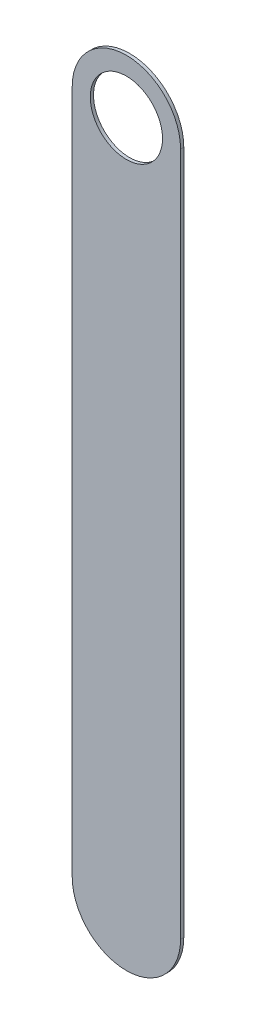
ISO-10303-21;
HEADER;
FILE_DESCRIPTION(('STEP AP214'),'2;1');
FILE_NAME('part.step','',(''),(''),'','','');
FILE_SCHEMA(('AUTOMOTIVE_DESIGN { 1 0 10303 214 1 1 1 1 }'));
ENDSEC;
DATA;
#1=APPLICATION_CONTEXT('core data for automotive mechanical design processes');
#2=APPLICATION_PROTOCOL_DEFINITION('international standard','automotive_design',2000,#1);
#3=PRODUCT_CONTEXT('',#1,'mechanical');
#4=PRODUCT('Part','Part','',(#3));
#5=PRODUCT_RELATED_PRODUCT_CATEGORY('part','',(#4));
#6=PRODUCT_DEFINITION_FORMATION('','',#4);
#7=PRODUCT_DEFINITION_CONTEXT('part definition',#1,'design');
#8=PRODUCT_DEFINITION('design','',#6,#7);
#9=PRODUCT_DEFINITION_SHAPE('','',#8);
#10=(LENGTH_UNIT() NAMED_UNIT(*) SI_UNIT(.MILLI.,.METRE.));
#11=(NAMED_UNIT(*) PLANE_ANGLE_UNIT() SI_UNIT($,.RADIAN.));
#12=(NAMED_UNIT(*) SI_UNIT($,.STERADIAN.) SOLID_ANGLE_UNIT());
#13=UNCERTAINTY_MEASURE_WITH_UNIT(LENGTH_MEASURE(1.E-05),#10,'distance_accuracy_value','');
#14=(GEOMETRIC_REPRESENTATION_CONTEXT(3) GLOBAL_UNCERTAINTY_ASSIGNED_CONTEXT((#13)) GLOBAL_UNIT_ASSIGNED_CONTEXT((#10,
#11,#12)) REPRESENTATION_CONTEXT('',''));
#15=CARTESIAN_POINT('',(0.,0.,0.));
#16=DIRECTION('',(0.,0.,1.));
#17=DIRECTION('',(1.,0.,0.));
#18=AXIS2_PLACEMENT_3D('',#15,#16,#17);
#19=CARTESIAN_POINT('',(55.4800008,55.01999664,0.));
#20=DIRECTION('',(-1.,0.,0.));
#21=DIRECTION('',(0.,1.,0.));
#22=AXIS2_PLACEMENT_3D('',#19,#20,#21);
#23=PLANE('',#22);
#24=DIRECTION('',(0.,1.,0.));
#25=VECTOR('',#24,1.);
#26=CARTESIAN_POINT('',(55.4800008,55.01999664,0.03556));
#27=LINE('',#26,#25);
#28=CARTESIAN_POINT('',(55.4800008,55.01999664,0.03556));
#29=VERTEX_POINT('',#28);
#30=CARTESIAN_POINT('',(55.4800008,62.6000272,0.03556));
#31=VERTEX_POINT('',#30);
#32=EDGE_CURVE('E11',#29,#31,#27,.T.);
#33=ORIENTED_EDGE('',*,*,#32,.F.);
#34=DIRECTION('',(0.,0.,1.));
#35=VECTOR('',#34,1.);
#36=CARTESIAN_POINT('',(55.4800008,55.01999664,0.));
#37=LINE('',#36,#35);
#38=CARTESIAN_POINT('',(55.4800008,55.01999664,0.));
#39=VERTEX_POINT('',#38);
#40=EDGE_CURVE('E24',#39,#29,#37,.T.);
#41=ORIENTED_EDGE('',*,*,#40,.F.);
#42=DIRECTION('',(0.,1.,0.));
#43=VECTOR('',#42,1.);
#44=CARTESIAN_POINT('',(55.4800008,55.01999664,0.));
#45=LINE('',#44,#43);
#46=CARTESIAN_POINT('',(55.4800008,62.6000272,0.));
#47=VERTEX_POINT('',#46);
#48=EDGE_CURVE('E96',#39,#47,#45,.T.);
#49=ORIENTED_EDGE('',*,*,#48,.T.);
#50=DIRECTION('',(0.,0.,1.));
#51=VECTOR('',#50,1.);
#52=CARTESIAN_POINT('',(55.4800008,62.6000272,0.));
#53=LINE('',#52,#51);
#54=EDGE_CURVE('E37',#47,#31,#53,.T.);
#55=ORIENTED_EDGE('',*,*,#54,.T.);
#56=EDGE_LOOP('',(#33,#41,#49,#55));
#57=FACE_BOUND('',#56,.T.);
#58=ADVANCED_FACE('F17',(#57),#23,.F.);
#59=CARTESIAN_POINT('',(54.880002,55.01999664,0.));
#60=DIRECTION('',(0.,0.,-1.));
#61=DIRECTION('',(-1.,0.,0.));
#62=AXIS2_PLACEMENT_3D('',#59,#60,#61);
#63=CYLINDRICAL_SURFACE('',#62,0.599998800000002);
#64=CARTESIAN_POINT('',(54.880002,55.01999664,0.03556));
#65=DIRECTION('',(0.,0.,1.));
#66=DIRECTION('',(-1.,0.,0.));
#67=AXIS2_PLACEMENT_3D('',#64,#65,#66);
#68=CIRCLE('',#67,0.599998800000002);
#69=CARTESIAN_POINT('',(54.2800032,55.01999664,0.03556));
#70=VERTEX_POINT('',#69);
#71=EDGE_CURVE('E92',#70,#29,#68,.T.);
#72=ORIENTED_EDGE('',*,*,#71,.F.);
#73=DIRECTION('',(0.,0.,1.));
#74=VECTOR('',#73,1.);
#75=CARTESIAN_POINT('',(54.2800032,55.01999664,0.));
#76=LINE('',#75,#74);
#77=CARTESIAN_POINT('',(54.2800032,55.01999664,0.));
#78=VERTEX_POINT('',#77);
#79=EDGE_CURVE('E90',#78,#70,#76,.T.);
#80=ORIENTED_EDGE('',*,*,#79,.F.);
#81=CARTESIAN_POINT('',(54.880002,55.01999664,0.));
#82=DIRECTION('',(0.,0.,1.));
#83=DIRECTION('',(-1.,0.,0.));
#84=AXIS2_PLACEMENT_3D('',#81,#82,#83);
#85=CIRCLE('',#84,0.599998800000002);
#86=EDGE_CURVE('E88',#78,#39,#85,.T.);
#87=ORIENTED_EDGE('',*,*,#86,.T.);
#88=ORIENTED_EDGE('',*,*,#40,.T.);
#89=EDGE_LOOP('',(#72,#80,#87,#88));
#90=FACE_BOUND('',#89,.T.);
#91=ADVANCED_FACE('F111',(#90),#63,.T.);
#92=CARTESIAN_POINT('',(54.880002,62.6000272,0.));
#93=DIRECTION('',(0.,0.,-1.));
#94=DIRECTION('',(1.,0.,0.));
#95=AXIS2_PLACEMENT_3D('',#92,#93,#94);
#96=CYLINDRICAL_SURFACE('',#95,0.599998800000002);
#97=CARTESIAN_POINT('',(54.880002,62.6000272,0.03556));
#98=DIRECTION('',(0.,0.,1.));
#99=DIRECTION('',(1.,0.,0.));
#100=AXIS2_PLACEMENT_3D('',#97,#98,#99);
#101=CIRCLE('',#100,0.599998800000002);
#102=CARTESIAN_POINT('',(54.2800032,62.6000272,0.03556));
#103=VERTEX_POINT('',#102);
#104=EDGE_CURVE('E85',#31,#103,#101,.T.);
#105=ORIENTED_EDGE('',*,*,#104,.F.);
#106=ORIENTED_EDGE('',*,*,#54,.F.);
#107=CARTESIAN_POINT('',(54.880002,62.6000272,0.));
#108=DIRECTION('',(0.,0.,1.));
#109=DIRECTION('',(1.,0.,0.));
#110=AXIS2_PLACEMENT_3D('',#107,#108,#109);
#111=CIRCLE('',#110,0.599998800000002);
#112=CARTESIAN_POINT('',(54.2800032,62.6000272,0.));
#113=VERTEX_POINT('',#112);
#114=EDGE_CURVE('E82',#47,#113,#111,.T.);
#115=ORIENTED_EDGE('',*,*,#114,.T.);
#116=DIRECTION('',(0.,0.,1.));
#117=VECTOR('',#116,1.);
#118=CARTESIAN_POINT('',(54.2800032,62.6000272,0.));
#119=LINE('',#118,#117);
#120=EDGE_CURVE('E80',#113,#103,#119,.T.);
#121=ORIENTED_EDGE('',*,*,#120,.T.);
#122=EDGE_LOOP('',(#105,#106,#115,#121));
#123=FACE_BOUND('',#122,.T.);
#124=ADVANCED_FACE('F104',(#123),#96,.T.);
#125=CARTESIAN_POINT('',(54.2800032,62.6000272,0.));
#126=DIRECTION('',(1.,0.,0.));
#127=DIRECTION('',(0.,-1.,0.));
#128=AXIS2_PLACEMENT_3D('',#125,#126,#127);
#129=PLANE('',#128);
#130=DIRECTION('',(0.,-1.,0.));
#131=VECTOR('',#130,1.);
#132=CARTESIAN_POINT('',(54.2800032,62.6000272,0.03556));
#133=LINE('',#132,#131);
#134=EDGE_CURVE('E77',#103,#70,#133,.T.);
#135=ORIENTED_EDGE('',*,*,#134,.F.);
#136=ORIENTED_EDGE('',*,*,#120,.F.);
#137=DIRECTION('',(0.,-1.,0.));
#138=VECTOR('',#137,1.);
#139=CARTESIAN_POINT('',(54.2800032,62.6000272,0.));
#140=LINE('',#139,#138);
#141=EDGE_CURVE('E68',#113,#78,#140,.T.);
#142=ORIENTED_EDGE('',*,*,#141,.T.);
#143=ORIENTED_EDGE('',*,*,#79,.T.);
#144=EDGE_LOOP('',(#135,#136,#142,#143));
#145=FACE_BOUND('',#144,.T.);
#146=ADVANCED_FACE('F110',(#145),#129,.F.);
#147=CARTESIAN_POINT('',(54.880002,62.6000272,0.));
#148=DIRECTION('',(0.,0.,-1.));
#149=DIRECTION('',(1.,0.,0.));
#150=AXIS2_PLACEMENT_3D('',#147,#148,#149);
#151=CYLINDRICAL_SURFACE('',#150,0.3999992);
#152=DIRECTION('',(0.,0.,1.));
#153=VECTOR('',#152,1.);
#154=CARTESIAN_POINT('',(55.2800012,62.6000272,0.));
#155=LINE('',#154,#153);
#156=CARTESIAN_POINT('',(55.2800012,62.6000272,0.));
#157=VERTEX_POINT('',#156);
#158=CARTESIAN_POINT('',(55.2800012,62.6000272,0.03556));
#159=VERTEX_POINT('',#158);
#160=EDGE_CURVE('E62',#157,#159,#155,.T.);
#161=ORIENTED_EDGE('',*,*,#160,.T.);
#162=CARTESIAN_POINT('',(54.880002,62.6000272,0.03556));
#163=DIRECTION('',(0.,0.,1.));
#164=DIRECTION('',(1.,0.,0.));
#165=AXIS2_PLACEMENT_3D('',#162,#163,#164);
#166=CIRCLE('',#165,0.3999992);
#167=EDGE_CURVE('E67',#159,#159,#166,.T.);
#168=ORIENTED_EDGE('',*,*,#167,.T.);
#169=ORIENTED_EDGE('',*,*,#160,.F.);
#170=CARTESIAN_POINT('',(54.880002,62.6000272,0.));
#171=DIRECTION('',(0.,0.,1.));
#172=DIRECTION('',(1.,0.,0.));
#173=AXIS2_PLACEMENT_3D('',#170,#171,#172);
#174=CIRCLE('',#173,0.3999992);
#175=EDGE_CURVE('E65',#157,#157,#174,.T.);
#176=ORIENTED_EDGE('',*,*,#175,.F.);
#177=EDGE_LOOP('',(#161,#168,#169,#176));
#178=FACE_BOUND('',#177,.T.);
#179=ADVANCED_FACE('F64',(#178),#151,.F.);
#180=CARTESIAN_POINT('',(55.4800008,55.01999664,0.));
#181=DIRECTION('',(0.,0.,-1.));
#182=DIRECTION('',(-1.,0.,0.));
#183=AXIS2_PLACEMENT_3D('',#180,#181,#182);
#184=PLANE('',#183);
#185=ORIENTED_EDGE('',*,*,#48,.F.);
#186=ORIENTED_EDGE('',*,*,#86,.F.);
#187=ORIENTED_EDGE('',*,*,#141,.F.);
#188=ORIENTED_EDGE('',*,*,#114,.F.);
#189=EDGE_LOOP('',(#185,#186,#187,#188));
#190=FACE_BOUND('',#189,.T.);
#191=ORIENTED_EDGE('',*,*,#175,.T.);
#192=EDGE_LOOP('',(#191));
#193=FACE_BOUND('',#192,.T.);
#194=ADVANCED_FACE('F71',(#190,#193),#184,.T.);
#195=CARTESIAN_POINT('',(55.4800008,55.01999664,0.03556));
#196=DIRECTION('',(0.,0.,-1.));
#197=DIRECTION('',(-1.,0.,0.));
#198=AXIS2_PLACEMENT_3D('',#195,#196,#197);
#199=PLANE('',#198);
#200=ORIENTED_EDGE('',*,*,#134,.T.);
#201=ORIENTED_EDGE('',*,*,#71,.T.);
#202=ORIENTED_EDGE('',*,*,#32,.T.);
#203=ORIENTED_EDGE('',*,*,#104,.T.);
#204=EDGE_LOOP('',(#200,#201,#202,#203));
#205=FACE_BOUND('',#204,.T.);
#206=ORIENTED_EDGE('',*,*,#167,.F.);
#207=EDGE_LOOP('',(#206));
#208=FACE_BOUND('',#207,.T.);
#209=ADVANCED_FACE('F107',(#205,#208),#199,.F.);
#210=CLOSED_SHELL('',(#58,#91,#124,#146,#179,#194,#209));
#211=MANIFOLD_SOLID_BREP('B1',#210);
#212=ADVANCED_BREP_SHAPE_REPRESENTATION('',(#18,#211),#14);
#213=SHAPE_DEFINITION_REPRESENTATION(#9,#212);
ENDSEC;
END-ISO-10303-21;
